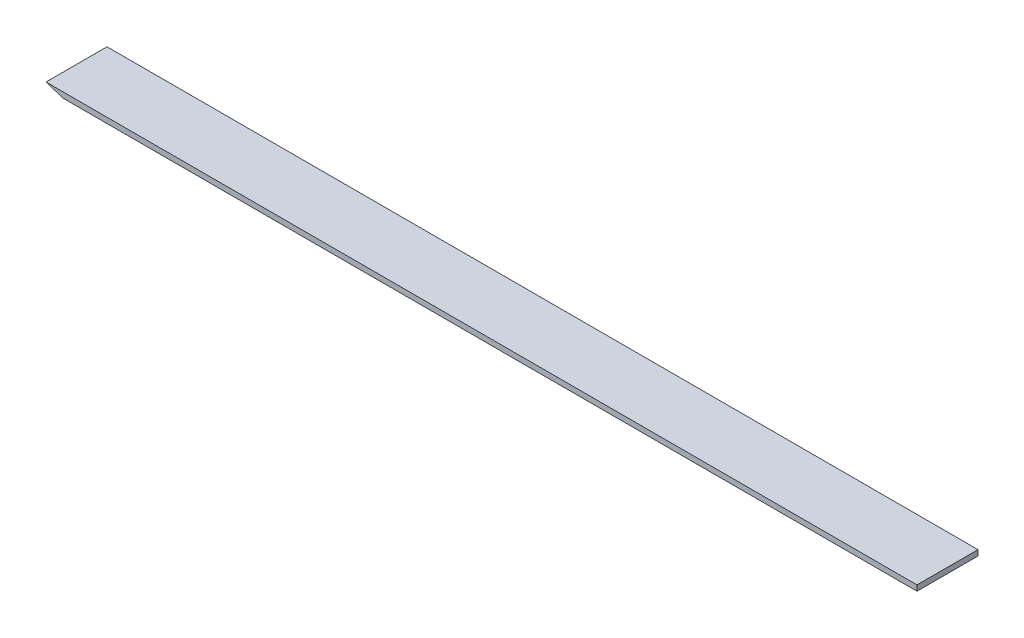
ISO-10303-21;
HEADER;
FILE_DESCRIPTION(('STEP AP214'),'2;1');
FILE_NAME('part.step','',(''),(''),'','','');
FILE_SCHEMA(('AUTOMOTIVE_DESIGN { 1 0 10303 214 1 1 1 1 }'));
ENDSEC;
DATA;
#1=APPLICATION_CONTEXT('core data for automotive mechanical design processes');
#2=APPLICATION_PROTOCOL_DEFINITION('international standard','automotive_design',2000,#1);
#3=PRODUCT_CONTEXT('',#1,'mechanical');
#4=PRODUCT('Part','Part','',(#3));
#5=PRODUCT_RELATED_PRODUCT_CATEGORY('part','',(#4));
#6=PRODUCT_DEFINITION_FORMATION('','',#4);
#7=PRODUCT_DEFINITION_CONTEXT('part definition',#1,'design');
#8=PRODUCT_DEFINITION('design','',#6,#7);
#9=PRODUCT_DEFINITION_SHAPE('','',#8);
#10=(LENGTH_UNIT() NAMED_UNIT(*) SI_UNIT(.MILLI.,.METRE.));
#11=(NAMED_UNIT(*) PLANE_ANGLE_UNIT() SI_UNIT($,.RADIAN.));
#12=(NAMED_UNIT(*) SI_UNIT($,.STERADIAN.) SOLID_ANGLE_UNIT());
#13=UNCERTAINTY_MEASURE_WITH_UNIT(LENGTH_MEASURE(1.E-05),#10,'distance_accuracy_value','');
#14=(GEOMETRIC_REPRESENTATION_CONTEXT(3) GLOBAL_UNCERTAINTY_ASSIGNED_CONTEXT((#13)) GLOBAL_UNIT_ASSIGNED_CONTEXT((#10,
#11,#12)) REPRESENTATION_CONTEXT('',''));
#15=CARTESIAN_POINT('',(0.,0.,0.));
#16=DIRECTION('',(0.,0.,1.));
#17=DIRECTION('',(1.,0.,0.));
#18=AXIS2_PLACEMENT_3D('',#15,#16,#17);
#19=CARTESIAN_POINT('',(1428.,-8.99999999999999,100.));
#20=DIRECTION('',(0.,-1.,0.));
#21=DIRECTION('',(1.,0.,0.));
#22=AXIS2_PLACEMENT_3D('',#19,#20,#21);
#23=PLANE('',#22);
#24=DIRECTION('',(-1.,0.,0.));
#25=VECTOR('',#24,1.);
#26=CARTESIAN_POINT('',(1428.,-8.99999999999999,0.));
#27=LINE('',#26,#25);
#28=CARTESIAN_POINT('',(1428.,-8.99999999999999,0.));
#29=VERTEX_POINT('',#28);
#30=CARTESIAN_POINT('',(28.,-9.00000000000004,0.));
#31=VERTEX_POINT('',#30);
#32=EDGE_CURVE('E109',#29,#31,#27,.T.);
#33=ORIENTED_EDGE('',*,*,#32,.F.);
#34=DIRECTION('',(0.,0.,-1.));
#35=VECTOR('',#34,1.);
#36=CARTESIAN_POINT('',(1428.,-8.99999999999999,100.));
#37=LINE('',#36,#35);
#38=CARTESIAN_POINT('',(1428.,-8.99999999999999,100.));
#39=VERTEX_POINT('',#38);
#40=EDGE_CURVE('E11',#39,#29,#37,.T.);
#41=ORIENTED_EDGE('',*,*,#40,.F.);
#42=DIRECTION('',(-1.,0.,0.));
#43=VECTOR('',#42,1.);
#44=CARTESIAN_POINT('',(1428.,-8.99999999999999,100.));
#45=LINE('',#44,#43);
#46=CARTESIAN_POINT('',(28.,-9.00000000000004,100.));
#47=VERTEX_POINT('',#46);
#48=EDGE_CURVE('E101',#39,#47,#45,.T.);
#49=ORIENTED_EDGE('',*,*,#48,.T.);
#50=DIRECTION('',(0.,0.,-1.));
#51=VECTOR('',#50,1.);
#52=CARTESIAN_POINT('',(28.,-9.00000000000004,100.));
#53=LINE('',#52,#51);
#54=EDGE_CURVE('E42',#47,#31,#53,.T.);
#55=ORIENTED_EDGE('',*,*,#54,.T.);
#56=EDGE_LOOP('',(#33,#41,#49,#55));
#57=FACE_BOUND('',#56,.T.);
#58=ADVANCED_FACE('F39',(#57),#23,.T.);
#59=CARTESIAN_POINT('',(1428.,0.,100.));
#60=DIRECTION('',(1.,0.,0.));
#61=DIRECTION('',(0.,0.,-1.));
#62=AXIS2_PLACEMENT_3D('',#59,#60,#61);
#63=PLANE('',#62);
#64=DIRECTION('',(0.,-1.,0.));
#65=VECTOR('',#64,1.);
#66=CARTESIAN_POINT('',(1428.,0.,0.));
#67=LINE('',#66,#65);
#68=CARTESIAN_POINT('',(1428.,0.,0.));
#69=VERTEX_POINT('',#68);
#70=EDGE_CURVE('E104',#69,#29,#67,.T.);
#71=ORIENTED_EDGE('',*,*,#70,.F.);
#72=DIRECTION('',(0.,0.,-1.));
#73=VECTOR('',#72,1.);
#74=CARTESIAN_POINT('',(1428.,0.,100.));
#75=LINE('',#74,#73);
#76=CARTESIAN_POINT('',(1428.,0.,100.));
#77=VERTEX_POINT('',#76);
#78=EDGE_CURVE('E49',#77,#69,#75,.T.);
#79=ORIENTED_EDGE('',*,*,#78,.F.);
#80=DIRECTION('',(0.,-1.,0.));
#81=VECTOR('',#80,1.);
#82=CARTESIAN_POINT('',(1428.,0.,100.));
#83=LINE('',#82,#81);
#84=EDGE_CURVE('E96',#77,#39,#83,.T.);
#85=ORIENTED_EDGE('',*,*,#84,.T.);
#86=ORIENTED_EDGE('',*,*,#40,.T.);
#87=EDGE_LOOP('',(#71,#79,#85,#86));
#88=FACE_BOUND('',#87,.T.);
#89=ADVANCED_FACE('F125',(#88),#63,.T.);
#90=CARTESIAN_POINT('',(0.,0.,100.));
#91=DIRECTION('',(0.,1.,0.));
#92=DIRECTION('',(0.,0.,1.));
#93=AXIS2_PLACEMENT_3D('',#90,#91,#92);
#94=PLANE('',#93);
#95=DIRECTION('',(1.,0.,0.));
#96=VECTOR('',#95,1.);
#97=CARTESIAN_POINT('',(0.,0.,0.));
#98=LINE('',#97,#96);
#99=CARTESIAN_POINT('',(0.,0.,0.));
#100=VERTEX_POINT('',#99);
#101=EDGE_CURVE('E90',#100,#69,#98,.T.);
#102=ORIENTED_EDGE('',*,*,#101,.F.);
#103=DIRECTION('',(0.,0.,-1.));
#104=VECTOR('',#103,1.);
#105=CARTESIAN_POINT('',(0.,0.,100.));
#106=LINE('',#105,#104);
#107=CARTESIAN_POINT('',(0.,0.,100.));
#108=VERTEX_POINT('',#107);
#109=EDGE_CURVE('E85',#108,#100,#106,.T.);
#110=ORIENTED_EDGE('',*,*,#109,.F.);
#111=DIRECTION('',(1.,0.,0.));
#112=VECTOR('',#111,1.);
#113=CARTESIAN_POINT('',(0.,0.,100.));
#114=LINE('',#113,#112);
#115=EDGE_CURVE('E88',#108,#77,#114,.T.);
#116=ORIENTED_EDGE('',*,*,#115,.T.);
#117=ORIENTED_EDGE('',*,*,#78,.T.);
#118=EDGE_LOOP('',(#102,#110,#116,#117));
#119=FACE_BOUND('',#118,.T.);
#120=ADVANCED_FACE('F87',(#119),#94,.T.);
#121=CARTESIAN_POINT('',(28.,-9.00000000000004,100.));
#122=DIRECTION('',(-0.306009180413122,-0.952028561285264,0.));
#123=DIRECTION('',(0.952028561285264,-0.306009180413122,0.));
#124=AXIS2_PLACEMENT_3D('',#121,#122,#123);
#125=PLANE('',#124);
#126=DIRECTION('',(-0.952028561285264,0.306009180413122,0.));
#127=VECTOR('',#126,1.);
#128=CARTESIAN_POINT('',(28.,-9.00000000000004,0.));
#129=LINE('',#128,#127);
#130=EDGE_CURVE('E113',#31,#100,#129,.T.);
#131=ORIENTED_EDGE('',*,*,#130,.F.);
#132=ORIENTED_EDGE('',*,*,#54,.F.);
#133=DIRECTION('',(-0.952028561285264,0.306009180413122,0.));
#134=VECTOR('',#133,1.);
#135=CARTESIAN_POINT('',(28.,-9.00000000000004,100.));
#136=LINE('',#135,#134);
#137=EDGE_CURVE('E95',#47,#108,#136,.T.);
#138=ORIENTED_EDGE('',*,*,#137,.T.);
#139=ORIENTED_EDGE('',*,*,#109,.T.);
#140=EDGE_LOOP('',(#131,#132,#138,#139));
#141=FACE_BOUND('',#140,.T.);
#142=ADVANCED_FACE('F99',(#141),#125,.T.);
#143=CARTESIAN_POINT('',(0.,0.,100.));
#144=DIRECTION('',(0.,0.,1.));
#145=DIRECTION('',(1.,0.,0.));
#146=AXIS2_PLACEMENT_3D('',#143,#144,#145);
#147=PLANE('',#146);
#148=ORIENTED_EDGE('',*,*,#48,.F.);
#149=ORIENTED_EDGE('',*,*,#84,.F.);
#150=ORIENTED_EDGE('',*,*,#115,.F.);
#151=ORIENTED_EDGE('',*,*,#137,.F.);
#152=EDGE_LOOP('',(#148,#149,#150,#151));
#153=FACE_BOUND('',#152,.T.);
#154=ADVANCED_FACE('F94',(#153),#147,.T.);
#155=CARTESIAN_POINT('',(0.,0.,0.));
#156=DIRECTION('',(0.,0.,1.));
#157=DIRECTION('',(1.,0.,0.));
#158=AXIS2_PLACEMENT_3D('',#155,#156,#157);
#159=PLANE('',#158);
#160=ORIENTED_EDGE('',*,*,#32,.T.);
#161=ORIENTED_EDGE('',*,*,#130,.T.);
#162=ORIENTED_EDGE('',*,*,#101,.T.);
#163=ORIENTED_EDGE('',*,*,#70,.T.);
#164=EDGE_LOOP('',(#160,#161,#162,#163));
#165=FACE_BOUND('',#164,.T.);
#166=ADVANCED_FACE('F124',(#165),#159,.F.);
#167=CLOSED_SHELL('',(#58,#89,#120,#142,#154,#166));
#168=MANIFOLD_SOLID_BREP('B2',#167);
#169=ADVANCED_BREP_SHAPE_REPRESENTATION('',(#18,#168),#14);
#170=SHAPE_DEFINITION_REPRESENTATION(#9,#169);
ENDSEC;
END-ISO-10303-21;
